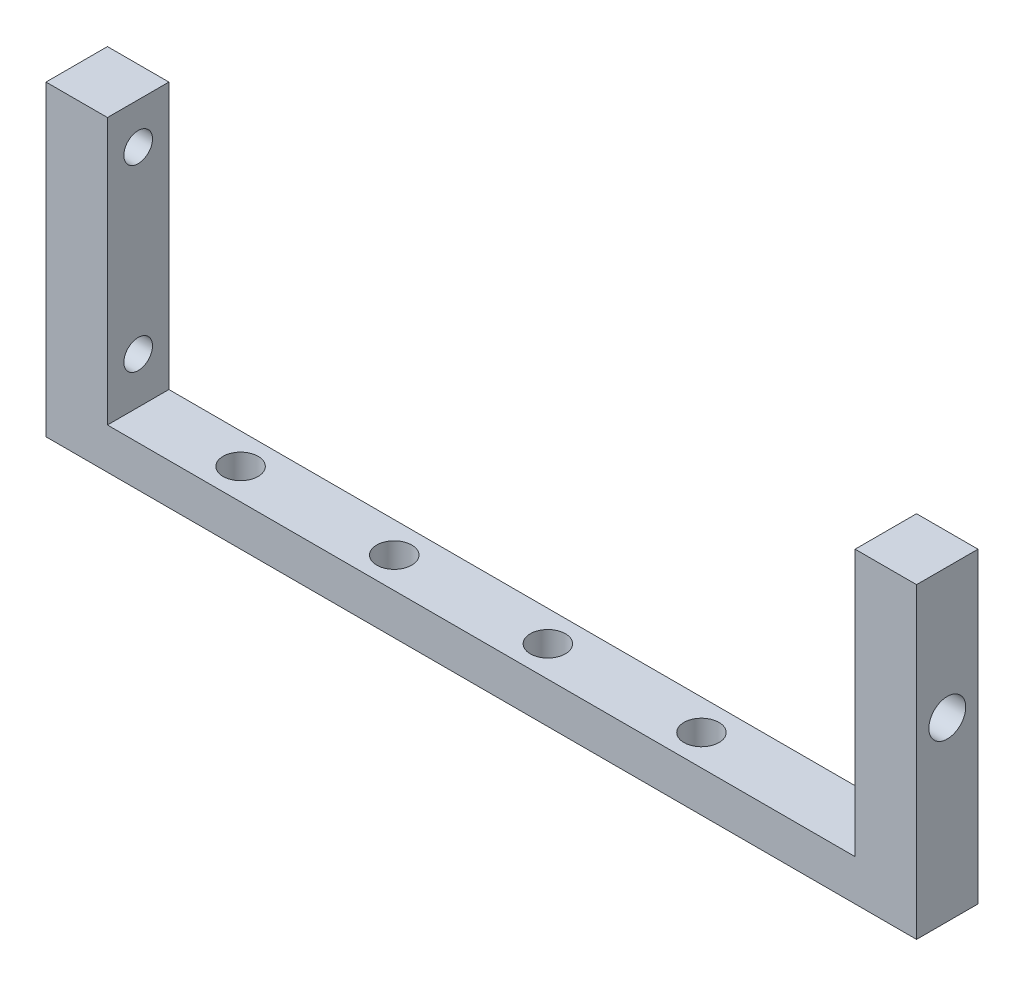
ISO-10303-21;
HEADER;
FILE_DESCRIPTION(('STEP AP214'),'2;1');
FILE_NAME('part.step','',(''),(''),'','','');
FILE_SCHEMA(('AUTOMOTIVE_DESIGN { 1 0 10303 214 1 1 1 1 }'));
ENDSEC;
DATA;
#1=APPLICATION_CONTEXT('core data for automotive mechanical design processes');
#2=APPLICATION_PROTOCOL_DEFINITION('international standard','automotive_design',2000,#1);
#3=PRODUCT_CONTEXT('',#1,'mechanical');
#4=PRODUCT('Part','Part','',(#3));
#5=PRODUCT_RELATED_PRODUCT_CATEGORY('part','',(#4));
#6=PRODUCT_DEFINITION_FORMATION('','',#4);
#7=PRODUCT_DEFINITION_CONTEXT('part definition',#1,'design');
#8=PRODUCT_DEFINITION('design','',#6,#7);
#9=PRODUCT_DEFINITION_SHAPE('','',#8);
#10=(LENGTH_UNIT() NAMED_UNIT(*) SI_UNIT(.MILLI.,.METRE.));
#11=(NAMED_UNIT(*) PLANE_ANGLE_UNIT() SI_UNIT($,.RADIAN.));
#12=(NAMED_UNIT(*) SI_UNIT($,.STERADIAN.) SOLID_ANGLE_UNIT());
#13=UNCERTAINTY_MEASURE_WITH_UNIT(LENGTH_MEASURE(1.E-05),#10,'distance_accuracy_value','');
#14=(GEOMETRIC_REPRESENTATION_CONTEXT(3) GLOBAL_UNCERTAINTY_ASSIGNED_CONTEXT((#13)) GLOBAL_UNIT_ASSIGNED_CONTEXT((#10,
#11,#12)) REPRESENTATION_CONTEXT('',''));
#15=CARTESIAN_POINT('',(0.,0.,0.));
#16=DIRECTION('',(0.,0.,1.));
#17=DIRECTION('',(1.,0.,0.));
#18=AXIS2_PLACEMENT_3D('',#15,#16,#17);
#19=CARTESIAN_POINT('',(0.,5.08,0.));
#20=DIRECTION('',(0.,1.,0.));
#21=DIRECTION('',(0.,0.,1.));
#22=AXIS2_PLACEMENT_3D('',#19,#20,#21);
#23=PLANE('',#22);
#24=CARTESIAN_POINT('',(-87.63,5.08,10.4548771292027));
#25=DIRECTION('',(0.,1.,0.));
#26=DIRECTION('',(0.,0.,1.));
#27=AXIS2_PLACEMENT_3D('',#24,#25,#26);
#28=CIRCLE('',#27,2.1717);
#29=CARTESIAN_POINT('',(-87.63,5.08,12.6265771292026));
#30=VERTEX_POINT('',#29);
#31=EDGE_CURVE('E398',#30,#30,#28,.T.);
#32=ORIENTED_EDGE('',*,*,#31,.F.);
#33=EDGE_LOOP('',(#32));
#34=FACE_BOUND('',#33,.T.);
#35=CARTESIAN_POINT('',(-68.58,5.08,10.4548771292027));
#36=DIRECTION('',(0.,1.,0.));
#37=DIRECTION('',(0.,0.,1.));
#38=AXIS2_PLACEMENT_3D('',#35,#36,#37);
#39=CIRCLE('',#38,2.1717);
#40=CARTESIAN_POINT('',(-68.58,5.08,12.6265771292026));
#41=VERTEX_POINT('',#40);
#42=EDGE_CURVE('E392',#41,#41,#39,.T.);
#43=ORIENTED_EDGE('',*,*,#42,.F.);
#44=EDGE_LOOP('',(#43));
#45=FACE_BOUND('',#44,.T.);
#46=CARTESIAN_POINT('',(-49.5300000000001,5.08,10.4548771292027));
#47=DIRECTION('',(0.,1.,0.));
#48=DIRECTION('',(0.,0.,1.));
#49=AXIS2_PLACEMENT_3D('',#46,#47,#48);
#50=CIRCLE('',#49,2.17169999999993);
#51=CARTESIAN_POINT('',(-49.5300000000001,5.08,12.6265771292026));
#52=VERTEX_POINT('',#51);
#53=EDGE_CURVE('E386',#52,#52,#50,.T.);
#54=ORIENTED_EDGE('',*,*,#53,.F.);
#55=EDGE_LOOP('',(#54));
#56=FACE_BOUND('',#55,.T.);
#57=CARTESIAN_POINT('',(-30.48,5.08,10.4548771292027));
#58=DIRECTION('',(0.,1.,0.));
#59=DIRECTION('',(0.,0.,1.));
#60=AXIS2_PLACEMENT_3D('',#57,#58,#59);
#61=CIRCLE('',#60,2.1717);
#62=CARTESIAN_POINT('',(-30.48,5.08,12.6265771292026));
#63=VERTEX_POINT('',#62);
#64=EDGE_CURVE('E372',#63,#63,#61,.T.);
#65=ORIENTED_EDGE('',*,*,#64,.F.);
#66=EDGE_LOOP('',(#65));
#67=FACE_BOUND('',#66,.T.);
#68=DIRECTION('',(1.,0.,0.));
#69=VECTOR('',#68,1.);
#70=CARTESIAN_POINT('',(-107.95,5.08,14.2648771292027));
#71=LINE('',#70,#69);
#72=CARTESIAN_POINT('',(-100.33,5.08,14.2648771292027));
#73=VERTEX_POINT('',#72);
#74=CARTESIAN_POINT('',(-7.62,5.08,14.2648771292027));
#75=VERTEX_POINT('',#74);
#76=EDGE_CURVE('E53',#73,#75,#71,.T.);
#77=ORIENTED_EDGE('',*,*,#76,.T.);
#78=DIRECTION('',(0.,0.,1.));
#79=VECTOR('',#78,1.);
#80=CARTESIAN_POINT('',(-7.62,5.08,14.2648771292027));
#81=LINE('',#80,#79);
#82=CARTESIAN_POINT('',(-7.62,5.08,6.64487712920265));
#83=VERTEX_POINT('',#82);
#84=EDGE_CURVE('E48',#83,#75,#81,.T.);
#85=ORIENTED_EDGE('',*,*,#84,.F.);
#86=DIRECTION('',(-1.,0.,0.));
#87=VECTOR('',#86,1.);
#88=CARTESIAN_POINT('',(-107.95,5.08,6.64487712920265));
#89=LINE('',#88,#87);
#90=CARTESIAN_POINT('',(-100.33,5.08,6.64487712920265));
#91=VERTEX_POINT('',#90);
#92=EDGE_CURVE('E155',#83,#91,#89,.T.);
#93=ORIENTED_EDGE('',*,*,#92,.T.);
#94=DIRECTION('',(0.,0.,-1.));
#95=VECTOR('',#94,1.);
#96=CARTESIAN_POINT('',(-100.33,5.08,14.2648771292027));
#97=LINE('',#96,#95);
#98=EDGE_CURVE('E134',#73,#91,#97,.T.);
#99=ORIENTED_EDGE('',*,*,#98,.F.);
#100=EDGE_LOOP('',(#77,#85,#93,#99));
#101=FACE_BOUND('',#100,.T.);
#102=ADVANCED_FACE('F33',(#34,#45,#56,#67,#101),#23,.T.);
#103=CARTESIAN_POINT('',(-107.95,5.08,6.64487712920265));
#104=DIRECTION('',(1.,0.,0.));
#105=DIRECTION('',(0.,0.,-1.));
#106=AXIS2_PLACEMENT_3D('',#103,#104,#105);
#107=PLANE('',#106);
#108=CARTESIAN_POINT('',(-107.95,33.02,10.4548771292027));
#109=DIRECTION('',(1.,0.,0.));
#110=DIRECTION('',(0.,0.,-1.));
#111=AXIS2_PLACEMENT_3D('',#108,#109,#110);
#112=CIRCLE('',#111,1.778);
#113=CARTESIAN_POINT('',(-107.95,33.02,8.67687712920265));
#114=VERTEX_POINT('',#113);
#115=EDGE_CURVE('E122',#114,#114,#112,.T.);
#116=ORIENTED_EDGE('',*,*,#115,.T.);
#117=EDGE_LOOP('',(#116));
#118=FACE_BOUND('',#117,.T.);
#119=CARTESIAN_POINT('',(-107.95,10.795,10.4548771292027));
#120=DIRECTION('',(1.,0.,0.));
#121=DIRECTION('',(0.,0.,-1.));
#122=AXIS2_PLACEMENT_3D('',#119,#120,#121);
#123=CIRCLE('',#122,1.778);
#124=CARTESIAN_POINT('',(-107.95,10.795,8.67687712920265));
#125=VERTEX_POINT('',#124);
#126=EDGE_CURVE('E358',#125,#125,#123,.T.);
#127=ORIENTED_EDGE('',*,*,#126,.T.);
#128=EDGE_LOOP('',(#127));
#129=FACE_BOUND('',#128,.T.);
#130=DIRECTION('',(0.,0.,1.));
#131=VECTOR('',#130,1.);
#132=CARTESIAN_POINT('',(-107.95,0.,6.64487712920265));
#133=LINE('',#132,#131);
#134=CARTESIAN_POINT('',(-107.95,0.,6.64487712920265));
#135=VERTEX_POINT('',#134);
#136=CARTESIAN_POINT('',(-107.95,0.,14.2648771292027));
#137=VERTEX_POINT('',#136);
#138=EDGE_CURVE('E153',#135,#137,#133,.T.);
#139=ORIENTED_EDGE('',*,*,#138,.T.);
#140=DIRECTION('',(0.,-1.,0.));
#141=VECTOR('',#140,1.);
#142=CARTESIAN_POINT('',(-107.95,5.08,14.2648771292027));
#143=LINE('',#142,#141);
#144=CARTESIAN_POINT('',(-107.95,38.1,14.2648771292027));
#145=VERTEX_POINT('',#144);
#146=EDGE_CURVE('E11',#145,#137,#143,.T.);
#147=ORIENTED_EDGE('',*,*,#146,.F.);
#148=DIRECTION('',(0.,0.,1.));
#149=VECTOR('',#148,1.);
#150=CARTESIAN_POINT('',(-107.95,38.1,14.2648771292027));
#151=LINE('',#150,#149);
#152=CARTESIAN_POINT('',(-107.95,38.1,6.64487712920265));
#153=VERTEX_POINT('',#152);
#154=EDGE_CURVE('E135',#153,#145,#151,.T.);
#155=ORIENTED_EDGE('',*,*,#154,.F.);
#156=DIRECTION('',(0.,-1.,0.));
#157=VECTOR('',#156,1.);
#158=CARTESIAN_POINT('',(-107.95,5.08,6.64487712920265));
#159=LINE('',#158,#157);
#160=EDGE_CURVE('E106',#153,#135,#159,.T.);
#161=ORIENTED_EDGE('',*,*,#160,.T.);
#162=EDGE_LOOP('',(#139,#147,#155,#161));
#163=FACE_BOUND('',#162,.T.);
#164=ADVANCED_FACE('F35',(#118,#129,#163),#107,.F.);
#165=CARTESIAN_POINT('',(-107.95,5.08,14.2648771292027));
#166=DIRECTION('',(0.,0.,-1.));
#167=DIRECTION('',(-1.,0.,0.));
#168=AXIS2_PLACEMENT_3D('',#165,#166,#167);
#169=PLANE('',#168);
#170=DIRECTION('',(1.,0.,0.));
#171=VECTOR('',#170,1.);
#172=CARTESIAN_POINT('',(-107.95,0.,14.2648771292027));
#173=LINE('',#172,#171);
#174=CARTESIAN_POINT('',(0.,0.,14.2648771292027));
#175=VERTEX_POINT('',#174);
#176=EDGE_CURVE('E160',#137,#175,#173,.T.);
#177=ORIENTED_EDGE('',*,*,#176,.T.);
#178=DIRECTION('',(0.,-1.,0.));
#179=VECTOR('',#178,1.);
#180=CARTESIAN_POINT('',(0.,5.08,14.2648771292027));
#181=LINE('',#180,#179);
#182=CARTESIAN_POINT('',(0.,38.1,14.2648771292027));
#183=VERTEX_POINT('',#182);
#184=EDGE_CURVE('E41',#183,#175,#181,.T.);
#185=ORIENTED_EDGE('',*,*,#184,.F.);
#186=DIRECTION('',(1.,0.,0.));
#187=VECTOR('',#186,1.);
#188=CARTESIAN_POINT('',(0.,38.1,14.2648771292027));
#189=LINE('',#188,#187);
#190=CARTESIAN_POINT('',(-7.62,38.1,14.2648771292027));
#191=VERTEX_POINT('',#190);
#192=EDGE_CURVE('E120',#191,#183,#189,.T.);
#193=ORIENTED_EDGE('',*,*,#192,.F.);
#194=DIRECTION('',(0.,-1.,0.));
#195=VECTOR('',#194,1.);
#196=CARTESIAN_POINT('',(-7.62,38.1,14.2648771292027));
#197=LINE('',#196,#195);
#198=EDGE_CURVE('E129',#191,#75,#197,.T.);
#199=ORIENTED_EDGE('',*,*,#198,.T.);
#200=ORIENTED_EDGE('',*,*,#76,.F.);
#201=DIRECTION('',(0.,-1.,0.));
#202=VECTOR('',#201,1.);
#203=CARTESIAN_POINT('',(-100.33,38.1,14.2648771292027));
#204=LINE('',#203,#202);
#205=CARTESIAN_POINT('',(-100.33,38.1,14.2648771292027));
#206=VERTEX_POINT('',#205);
#207=EDGE_CURVE('E150',#206,#73,#204,.T.);
#208=ORIENTED_EDGE('',*,*,#207,.F.);
#209=DIRECTION('',(1.,0.,0.));
#210=VECTOR('',#209,1.);
#211=CARTESIAN_POINT('',(-107.95,38.1,14.2648771292027));
#212=LINE('',#211,#210);
#213=EDGE_CURVE('E138',#145,#206,#212,.T.);
#214=ORIENTED_EDGE('',*,*,#213,.F.);
#215=ORIENTED_EDGE('',*,*,#146,.T.);
#216=EDGE_LOOP('',(#177,#185,#193,#199,#200,#208,#214,#215));
#217=FACE_BOUND('',#216,.T.);
#218=ADVANCED_FACE('F180',(#217),#169,.F.);
#219=CARTESIAN_POINT('',(0.,5.08,6.64487712920265));
#220=DIRECTION('',(-1.,0.,0.));
#221=DIRECTION('',(0.,0.,1.));
#222=AXIS2_PLACEMENT_3D('',#219,#220,#221);
#223=PLANE('',#222);
#224=CARTESIAN_POINT('',(0.,21.9075,10.4548771292027));
#225=DIRECTION('',(-1.,0.,0.));
#226=DIRECTION('',(0.,0.,1.));
#227=AXIS2_PLACEMENT_3D('',#224,#225,#226);
#228=CIRCLE('',#227,2.286);
#229=CARTESIAN_POINT('',(0.,21.9075,12.7408771292027));
#230=VERTEX_POINT('',#229);
#231=EDGE_CURVE('E362',#230,#230,#228,.T.);
#232=ORIENTED_EDGE('',*,*,#231,.T.);
#233=EDGE_LOOP('',(#232));
#234=FACE_BOUND('',#233,.T.);
#235=DIRECTION('',(0.,0.,-1.));
#236=VECTOR('',#235,1.);
#237=CARTESIAN_POINT('',(0.,0.,6.64487712920265));
#238=LINE('',#237,#236);
#239=CARTESIAN_POINT('',(0.,0.,6.64487712920265));
#240=VERTEX_POINT('',#239);
#241=EDGE_CURVE('E103',#175,#240,#238,.T.);
#242=ORIENTED_EDGE('',*,*,#241,.T.);
#243=DIRECTION('',(0.,-1.,0.));
#244=VECTOR('',#243,1.);
#245=CARTESIAN_POINT('',(0.,5.08,6.64487712920265));
#246=LINE('',#245,#244);
#247=CARTESIAN_POINT('',(0.,38.1,6.64487712920265));
#248=VERTEX_POINT('',#247);
#249=EDGE_CURVE('E96',#248,#240,#246,.T.);
#250=ORIENTED_EDGE('',*,*,#249,.F.);
#251=DIRECTION('',(0.,0.,-1.));
#252=VECTOR('',#251,1.);
#253=CARTESIAN_POINT('',(0.,38.1,14.2648771292027));
#254=LINE('',#253,#252);
#255=EDGE_CURVE('E101',#183,#248,#254,.T.);
#256=ORIENTED_EDGE('',*,*,#255,.F.);
#257=ORIENTED_EDGE('',*,*,#184,.T.);
#258=EDGE_LOOP('',(#242,#250,#256,#257));
#259=FACE_BOUND('',#258,.T.);
#260=ADVANCED_FACE('F98',(#234,#259),#223,.F.);
#261=CARTESIAN_POINT('',(-107.95,5.08,6.64487712920265));
#262=DIRECTION('',(0.,0.,1.));
#263=DIRECTION('',(1.,0.,0.));
#264=AXIS2_PLACEMENT_3D('',#261,#262,#263);
#265=PLANE('',#264);
#266=DIRECTION('',(-1.,0.,0.));
#267=VECTOR('',#266,1.);
#268=CARTESIAN_POINT('',(-107.95,0.,6.64487712920265));
#269=LINE('',#268,#267);
#270=EDGE_CURVE('E156',#240,#135,#269,.T.);
#271=ORIENTED_EDGE('',*,*,#270,.T.);
#272=ORIENTED_EDGE('',*,*,#160,.F.);
#273=DIRECTION('',(-1.,0.,0.));
#274=VECTOR('',#273,1.);
#275=CARTESIAN_POINT('',(-107.95,38.1,6.64487712920265));
#276=LINE('',#275,#274);
#277=CARTESIAN_POINT('',(-100.33,38.1,6.64487712920265));
#278=VERTEX_POINT('',#277);
#279=EDGE_CURVE('E142',#278,#153,#276,.T.);
#280=ORIENTED_EDGE('',*,*,#279,.F.);
#281=DIRECTION('',(0.,-1.,0.));
#282=VECTOR('',#281,1.);
#283=CARTESIAN_POINT('',(-100.33,38.1,6.64487712920265));
#284=LINE('',#283,#282);
#285=EDGE_CURVE('E145',#278,#91,#284,.T.);
#286=ORIENTED_EDGE('',*,*,#285,.T.);
#287=ORIENTED_EDGE('',*,*,#92,.F.);
#288=DIRECTION('',(0.,-1.,0.));
#289=VECTOR('',#288,1.);
#290=CARTESIAN_POINT('',(-7.62,38.1,6.64487712920265));
#291=LINE('',#290,#289);
#292=CARTESIAN_POINT('',(-7.62,38.1,6.64487712920265));
#293=VERTEX_POINT('',#292);
#294=EDGE_CURVE('E112',#293,#83,#291,.T.);
#295=ORIENTED_EDGE('',*,*,#294,.F.);
#296=DIRECTION('',(-1.,0.,0.));
#297=VECTOR('',#296,1.);
#298=CARTESIAN_POINT('',(0.,38.1,6.64487712920265));
#299=LINE('',#298,#297);
#300=EDGE_CURVE('E109',#248,#293,#299,.T.);
#301=ORIENTED_EDGE('',*,*,#300,.F.);
#302=ORIENTED_EDGE('',*,*,#249,.T.);
#303=EDGE_LOOP('',(#271,#272,#280,#286,#287,#295,#301,#302));
#304=FACE_BOUND('',#303,.T.);
#305=ADVANCED_FACE('F110',(#304),#265,.F.);
#306=CARTESIAN_POINT('',(0.,0.,0.));
#307=DIRECTION('',(0.,1.,0.));
#308=DIRECTION('',(0.,0.,1.));
#309=AXIS2_PLACEMENT_3D('',#306,#307,#308);
#310=PLANE('',#309);
#311=CARTESIAN_POINT('',(-87.63,0.,10.4548771292027));
#312=DIRECTION('',(0.,1.,0.));
#313=DIRECTION('',(0.,0.,1.));
#314=AXIS2_PLACEMENT_3D('',#311,#312,#313);
#315=CIRCLE('',#314,2.1717);
#316=CARTESIAN_POINT('',(-87.63,0.,12.6265771292026));
#317=VERTEX_POINT('',#316);
#318=EDGE_CURVE('E369',#317,#317,#315,.T.);
#319=ORIENTED_EDGE('',*,*,#318,.T.);
#320=EDGE_LOOP('',(#319));
#321=FACE_BOUND('',#320,.T.);
#322=CARTESIAN_POINT('',(-68.58,0.,10.4548771292027));
#323=DIRECTION('',(0.,1.,0.));
#324=DIRECTION('',(0.,0.,1.));
#325=AXIS2_PLACEMENT_3D('',#322,#323,#324);
#326=CIRCLE('',#325,2.1717);
#327=CARTESIAN_POINT('',(-68.58,0.,12.6265771292026));
#328=VERTEX_POINT('',#327);
#329=EDGE_CURVE('E395',#328,#328,#326,.T.);
#330=ORIENTED_EDGE('',*,*,#329,.T.);
#331=EDGE_LOOP('',(#330));
#332=FACE_BOUND('',#331,.T.);
#333=CARTESIAN_POINT('',(-49.5300000000001,0.,10.4548771292027));
#334=DIRECTION('',(0.,1.,0.));
#335=DIRECTION('',(0.,0.,1.));
#336=AXIS2_PLACEMENT_3D('',#333,#334,#335);
#337=CIRCLE('',#336,2.17169999999993);
#338=CARTESIAN_POINT('',(-49.5300000000001,0.,12.6265771292026));
#339=VERTEX_POINT('',#338);
#340=EDGE_CURVE('E389',#339,#339,#337,.T.);
#341=ORIENTED_EDGE('',*,*,#340,.T.);
#342=EDGE_LOOP('',(#341));
#343=FACE_BOUND('',#342,.T.);
#344=CARTESIAN_POINT('',(-30.48,0.,10.4548771292027));
#345=DIRECTION('',(0.,1.,0.));
#346=DIRECTION('',(0.,0.,1.));
#347=AXIS2_PLACEMENT_3D('',#344,#345,#346);
#348=CIRCLE('',#347,2.1717);
#349=CARTESIAN_POINT('',(-30.48,0.,12.6265771292026));
#350=VERTEX_POINT('',#349);
#351=EDGE_CURVE('E383',#350,#350,#348,.T.);
#352=ORIENTED_EDGE('',*,*,#351,.T.);
#353=EDGE_LOOP('',(#352));
#354=FACE_BOUND('',#353,.T.);
#355=ORIENTED_EDGE('',*,*,#138,.F.);
#356=ORIENTED_EDGE('',*,*,#270,.F.);
#357=ORIENTED_EDGE('',*,*,#241,.F.);
#358=ORIENTED_EDGE('',*,*,#176,.F.);
#359=EDGE_LOOP('',(#355,#356,#357,#358));
#360=FACE_BOUND('',#359,.T.);
#361=ADVANCED_FACE('F168',(#321,#332,#343,#354,#360),#310,.F.);
#362=CARTESIAN_POINT('',(-100.33,38.1,14.2648771292027));
#363=DIRECTION('',(-1.,0.,0.));
#364=DIRECTION('',(0.,0.,1.));
#365=AXIS2_PLACEMENT_3D('',#362,#363,#364);
#366=PLANE('',#365);
#367=CARTESIAN_POINT('',(-100.33,33.02,10.4548771292027));
#368=DIRECTION('',(1.,0.,0.));
#369=DIRECTION('',(0.,0.,-1.));
#370=AXIS2_PLACEMENT_3D('',#367,#368,#369);
#371=CIRCLE('',#370,1.778);
#372=CARTESIAN_POINT('',(-100.33,33.02,8.67687712920265));
#373=VERTEX_POINT('',#372);
#374=EDGE_CURVE('E363',#373,#373,#371,.T.);
#375=ORIENTED_EDGE('',*,*,#374,.F.);
#376=EDGE_LOOP('',(#375));
#377=FACE_BOUND('',#376,.T.);
#378=CARTESIAN_POINT('',(-100.33,10.795,10.4548771292027));
#379=DIRECTION('',(1.,0.,0.));
#380=DIRECTION('',(0.,0.,-1.));
#381=AXIS2_PLACEMENT_3D('',#378,#379,#380);
#382=CIRCLE('',#381,1.778);
#383=CARTESIAN_POINT('',(-100.33,10.795,8.67687712920265));
#384=VERTEX_POINT('',#383);
#385=EDGE_CURVE('E125',#384,#384,#382,.T.);
#386=ORIENTED_EDGE('',*,*,#385,.F.);
#387=EDGE_LOOP('',(#386));
#388=FACE_BOUND('',#387,.T.);
#389=ORIENTED_EDGE('',*,*,#98,.T.);
#390=ORIENTED_EDGE('',*,*,#285,.F.);
#391=DIRECTION('',(0.,0.,-1.));
#392=VECTOR('',#391,1.);
#393=CARTESIAN_POINT('',(-100.33,38.1,14.2648771292027));
#394=LINE('',#393,#392);
#395=EDGE_CURVE('E140',#206,#278,#394,.T.);
#396=ORIENTED_EDGE('',*,*,#395,.F.);
#397=ORIENTED_EDGE('',*,*,#207,.T.);
#398=EDGE_LOOP('',(#389,#390,#396,#397));
#399=FACE_BOUND('',#398,.T.);
#400=ADVANCED_FACE('F179',(#377,#388,#399),#366,.F.);
#401=CARTESIAN_POINT('',(0.,38.1,0.));
#402=DIRECTION('',(0.,-1.,0.));
#403=DIRECTION('',(0.,0.,-1.));
#404=AXIS2_PLACEMENT_3D('',#401,#402,#403);
#405=PLANE('',#404);
#406=ORIENTED_EDGE('',*,*,#154,.T.);
#407=ORIENTED_EDGE('',*,*,#213,.T.);
#408=ORIENTED_EDGE('',*,*,#395,.T.);
#409=ORIENTED_EDGE('',*,*,#279,.T.);
#410=EDGE_LOOP('',(#406,#407,#408,#409));
#411=FACE_BOUND('',#410,.T.);
#412=ADVANCED_FACE('F174',(#411),#405,.F.);
#413=CARTESIAN_POINT('',(-7.62,38.1,14.2648771292027));
#414=DIRECTION('',(1.,0.,0.));
#415=DIRECTION('',(0.,0.,-1.));
#416=AXIS2_PLACEMENT_3D('',#413,#414,#415);
#417=PLANE('',#416);
#418=CARTESIAN_POINT('',(-7.62,21.9075,10.4548771292027));
#419=DIRECTION('',(-1.,0.,0.));
#420=DIRECTION('',(0.,0.,1.));
#421=AXIS2_PLACEMENT_3D('',#418,#419,#420);
#422=CIRCLE('',#421,2.286);
#423=CARTESIAN_POINT('',(-7.62,21.9075,12.7408771292027));
#424=VERTEX_POINT('',#423);
#425=EDGE_CURVE('E365',#424,#424,#422,.T.);
#426=ORIENTED_EDGE('',*,*,#425,.F.);
#427=EDGE_LOOP('',(#426));
#428=FACE_BOUND('',#427,.T.);
#429=ORIENTED_EDGE('',*,*,#84,.T.);
#430=ORIENTED_EDGE('',*,*,#198,.F.);
#431=DIRECTION('',(0.,0.,1.));
#432=VECTOR('',#431,1.);
#433=CARTESIAN_POINT('',(-7.62,38.1,14.2648771292027));
#434=LINE('',#433,#432);
#435=EDGE_CURVE('E115',#293,#191,#434,.T.);
#436=ORIENTED_EDGE('',*,*,#435,.F.);
#437=ORIENTED_EDGE('',*,*,#294,.T.);
#438=EDGE_LOOP('',(#429,#430,#436,#437));
#439=FACE_BOUND('',#438,.T.);
#440=ADVANCED_FACE('F183',(#428,#439),#417,.F.);
#441=CARTESIAN_POINT('',(0.,38.1,0.));
#442=DIRECTION('',(0.,1.,0.));
#443=DIRECTION('',(0.,0.,1.));
#444=AXIS2_PLACEMENT_3D('',#441,#442,#443);
#445=PLANE('',#444);
#446=ORIENTED_EDGE('',*,*,#255,.T.);
#447=ORIENTED_EDGE('',*,*,#300,.T.);
#448=ORIENTED_EDGE('',*,*,#435,.T.);
#449=ORIENTED_EDGE('',*,*,#192,.T.);
#450=EDGE_LOOP('',(#446,#447,#448,#449));
#451=FACE_BOUND('',#450,.T.);
#452=ADVANCED_FACE('F118',(#451),#445,.T.);
#453=CARTESIAN_POINT('',(-107.95,10.795,10.4548771292027));
#454=DIRECTION('',(1.,0.,0.));
#455=DIRECTION('',(0.,0.,-1.));
#456=AXIS2_PLACEMENT_3D('',#453,#454,#455);
#457=CYLINDRICAL_SURFACE('',#456,1.778);
#458=CARTESIAN_POINT('',(-107.95,10.795,8.67687712920265));
#459=CARTESIAN_POINT('',(-107.870625,10.795,8.67687712920265));
#460=CARTESIAN_POINT('',(-107.79125,10.795,8.67687712920265));
#461=CARTESIAN_POINT('',(-107.6325,10.795,8.67687712920265));
#462=CARTESIAN_POINT('',(-107.553125,10.795,8.67687712920265));
#463=CARTESIAN_POINT('',(-107.394375,10.795,8.67687712920265));
#464=CARTESIAN_POINT('',(-107.315,10.795,8.67687712920265));
#465=CARTESIAN_POINT('',(-107.15625,10.795,8.67687712920265));
#466=CARTESIAN_POINT('',(-107.076875,10.795,8.67687712920265));
#467=CARTESIAN_POINT('',(-106.918125,10.795,8.67687712920265));
#468=CARTESIAN_POINT('',(-106.83875,10.795,8.67687712920265));
#469=CARTESIAN_POINT('',(-106.68,10.795,8.67687712920265));
#470=CARTESIAN_POINT('',(-106.600625,10.795,8.67687712920265));
#471=CARTESIAN_POINT('',(-106.441875,10.795,8.67687712920265));
#472=CARTESIAN_POINT('',(-106.3625,10.795,8.67687712920265));
#473=CARTESIAN_POINT('',(-106.20375,10.795,8.67687712920265));
#474=CARTESIAN_POINT('',(-106.124375,10.795,8.67687712920265));
#475=CARTESIAN_POINT('',(-105.965625,10.795,8.67687712920265));
#476=CARTESIAN_POINT('',(-105.88625,10.795,8.67687712920265));
#477=CARTESIAN_POINT('',(-105.7275,10.795,8.67687712920265));
#478=CARTESIAN_POINT('',(-105.648125,10.795,8.67687712920265));
#479=CARTESIAN_POINT('',(-105.489375,10.795,8.67687712920265));
#480=CARTESIAN_POINT('',(-105.41,10.795,8.67687712920265));
#481=CARTESIAN_POINT('',(-105.25125,10.795,8.67687712920265));
#482=CARTESIAN_POINT('',(-105.171875,10.795,8.67687712920265));
#483=CARTESIAN_POINT('',(-105.013125,10.795,8.67687712920265));
#484=CARTESIAN_POINT('',(-104.93375,10.795,8.67687712920265));
#485=CARTESIAN_POINT('',(-104.775,10.795,8.67687712920265));
#486=CARTESIAN_POINT('',(-104.695625,10.795,8.67687712920265));
#487=CARTESIAN_POINT('',(-104.536875,10.795,8.67687712920265));
#488=CARTESIAN_POINT('',(-104.4575,10.795,8.67687712920265));
#489=CARTESIAN_POINT('',(-104.29875,10.795,8.67687712920265));
#490=CARTESIAN_POINT('',(-104.219375,10.795,8.67687712920265));
#491=CARTESIAN_POINT('',(-104.060625,10.795,8.67687712920265));
#492=CARTESIAN_POINT('',(-103.98125,10.795,8.67687712920265));
#493=CARTESIAN_POINT('',(-103.8225,10.795,8.67687712920265));
#494=CARTESIAN_POINT('',(-103.743125,10.795,8.67687712920265));
#495=CARTESIAN_POINT('',(-103.584375,10.795,8.67687712920265));
#496=CARTESIAN_POINT('',(-103.505,10.795,8.67687712920265));
#497=CARTESIAN_POINT('',(-103.34625,10.795,8.67687712920265));
#498=CARTESIAN_POINT('',(-103.266875,10.795,8.67687712920265));
#499=CARTESIAN_POINT('',(-103.108125,10.795,8.67687712920265));
#500=CARTESIAN_POINT('',(-103.02875,10.795,8.67687712920265));
#501=CARTESIAN_POINT('',(-102.87,10.795,8.67687712920265));
#502=CARTESIAN_POINT('',(-102.790625,10.795,8.67687712920265));
#503=CARTESIAN_POINT('',(-102.631875,10.795,8.67687712920265));
#504=CARTESIAN_POINT('',(-102.5525,10.795,8.67687712920265));
#505=CARTESIAN_POINT('',(-102.39375,10.795,8.67687712920265));
#506=CARTESIAN_POINT('',(-102.314375,10.795,8.67687712920265));
#507=CARTESIAN_POINT('',(-102.155625,10.795,8.67687712920265));
#508=CARTESIAN_POINT('',(-102.07625,10.795,8.67687712920265));
#509=CARTESIAN_POINT('',(-101.9175,10.795,8.67687712920265));
#510=CARTESIAN_POINT('',(-101.838125,10.795,8.67687712920265));
#511=CARTESIAN_POINT('',(-101.679375,10.795,8.67687712920265));
#512=CARTESIAN_POINT('',(-101.6,10.795,8.67687712920265));
#513=CARTESIAN_POINT('',(-101.44125,10.795,8.67687712920265));
#514=CARTESIAN_POINT('',(-101.361875,10.795,8.67687712920265));
#515=CARTESIAN_POINT('',(-101.203125,10.795,8.67687712920265));
#516=CARTESIAN_POINT('',(-101.12375,10.795,8.67687712920265));
#517=CARTESIAN_POINT('',(-100.965,10.795,8.67687712920265));
#518=CARTESIAN_POINT('',(-100.885625,10.795,8.67687712920265));
#519=CARTESIAN_POINT('',(-100.726875,10.795,8.67687712920265));
#520=CARTESIAN_POINT('',(-100.6475,10.795,8.67687712920265));
#521=CARTESIAN_POINT('',(-100.48875,10.795,8.67687712920265));
#522=CARTESIAN_POINT('',(-100.409375,10.795,8.67687712920265));
#523=CARTESIAN_POINT('',(-100.33,10.795,8.67687712920265));
#524=B_SPLINE_CURVE_WITH_KNOTS('',3,(#458,#459,#460,#461,#462,#463,#464,#465,#466,#467,#468,
#469,#470,#471,#472,#473,#474,#475,#476,#477,#478,#479,#480,#481,#482,#483,#484,#485,#486,#487,
#488,#489,#490,#491,#492,#493,#494,#495,#496,#497,#498,#499,#500,#501,#502,#503,#504,#505,#506,
#507,#508,#509,#510,#511,#512,#513,#514,#515,#516,#517,#518,#519,#520,#521,#522,#523),
.UNSPECIFIED.,.F.,.F.,(4,2,2,2,2,2,2,2,2,2,2,2,2,2,2,2,2,2,2,2,2,2,2,2,2,2,2,2,2,2,2,2,4),(0.,
0.238125000000006,0.476250000000011,0.714375000000003,0.952500000000009,1.190625,
1.42875000000001,1.66687500000001,1.905,2.14312500000001,2.38125,2.61937500000001,
2.85750000000001,3.095625,3.33375000000001,3.571875,3.81000000000001,4.04812500000001,
4.28625000000001,4.52437500000001,4.7625,5.00062500000001,5.23875000000001,5.47687500000001,
5.71500000000001,5.953125,6.19125000000001,6.42937500000001,6.66750000000001,6.90562500000001,
7.14375,7.38187500000001,7.62000000000002),.UNSPECIFIED.);
#525=EDGE_CURVE('BSEAM191',#125,#384,#524,.T.);
#526=ORIENTED_EDGE('',*,*,#126,.F.);
#527=ORIENTED_EDGE('',*,*,#385,.T.);
#528=ORIENTED_EDGE('',*,*,#525,.T.);
#529=ORIENTED_EDGE('',*,*,#525,.F.);
#530=EDGE_LOOP('',(#526,#528,#527,#529));
#531=FACE_BOUND('',#530,.T.);
#532=ADVANCED_FACE('F191',(#531),#457,.F.);
#533=CARTESIAN_POINT('',(-107.95,33.02,10.4548771292027));
#534=DIRECTION('',(1.,0.,0.));
#535=DIRECTION('',(0.,0.,-1.));
#536=AXIS2_PLACEMENT_3D('',#533,#534,#535);
#537=CYLINDRICAL_SURFACE('',#536,1.778);
#538=CARTESIAN_POINT('',(-107.95,33.02,8.67687712920265));
#539=CARTESIAN_POINT('',(-107.870625,33.02,8.67687712920265));
#540=CARTESIAN_POINT('',(-107.79125,33.02,8.67687712920265));
#541=CARTESIAN_POINT('',(-107.6325,33.02,8.67687712920265));
#542=CARTESIAN_POINT('',(-107.553125,33.02,8.67687712920265));
#543=CARTESIAN_POINT('',(-107.394375,33.02,8.67687712920265));
#544=CARTESIAN_POINT('',(-107.315,33.02,8.67687712920265));
#545=CARTESIAN_POINT('',(-107.15625,33.02,8.67687712920265));
#546=CARTESIAN_POINT('',(-107.076875,33.02,8.67687712920265));
#547=CARTESIAN_POINT('',(-106.918125,33.02,8.67687712920265));
#548=CARTESIAN_POINT('',(-106.83875,33.02,8.67687712920265));
#549=CARTESIAN_POINT('',(-106.68,33.02,8.67687712920265));
#550=CARTESIAN_POINT('',(-106.600625,33.02,8.67687712920265));
#551=CARTESIAN_POINT('',(-106.441875,33.02,8.67687712920265));
#552=CARTESIAN_POINT('',(-106.3625,33.02,8.67687712920265));
#553=CARTESIAN_POINT('',(-106.20375,33.02,8.67687712920265));
#554=CARTESIAN_POINT('',(-106.124375,33.02,8.67687712920265));
#555=CARTESIAN_POINT('',(-105.965625,33.02,8.67687712920265));
#556=CARTESIAN_POINT('',(-105.88625,33.02,8.67687712920265));
#557=CARTESIAN_POINT('',(-105.7275,33.02,8.67687712920265));
#558=CARTESIAN_POINT('',(-105.648125,33.02,8.67687712920265));
#559=CARTESIAN_POINT('',(-105.489375,33.02,8.67687712920265));
#560=CARTESIAN_POINT('',(-105.41,33.02,8.67687712920265));
#561=CARTESIAN_POINT('',(-105.25125,33.02,8.67687712920265));
#562=CARTESIAN_POINT('',(-105.171875,33.02,8.67687712920265));
#563=CARTESIAN_POINT('',(-105.013125,33.02,8.67687712920265));
#564=CARTESIAN_POINT('',(-104.93375,33.02,8.67687712920265));
#565=CARTESIAN_POINT('',(-104.775,33.02,8.67687712920265));
#566=CARTESIAN_POINT('',(-104.695625,33.02,8.67687712920265));
#567=CARTESIAN_POINT('',(-104.536875,33.02,8.67687712920265));
#568=CARTESIAN_POINT('',(-104.4575,33.02,8.67687712920265));
#569=CARTESIAN_POINT('',(-104.29875,33.02,8.67687712920265));
#570=CARTESIAN_POINT('',(-104.219375,33.02,8.67687712920265));
#571=CARTESIAN_POINT('',(-104.060625,33.02,8.67687712920265));
#572=CARTESIAN_POINT('',(-103.98125,33.02,8.67687712920265));
#573=CARTESIAN_POINT('',(-103.8225,33.02,8.67687712920265));
#574=CARTESIAN_POINT('',(-103.743125,33.02,8.67687712920265));
#575=CARTESIAN_POINT('',(-103.584375,33.02,8.67687712920265));
#576=CARTESIAN_POINT('',(-103.505,33.02,8.67687712920265));
#577=CARTESIAN_POINT('',(-103.34625,33.02,8.67687712920265));
#578=CARTESIAN_POINT('',(-103.266875,33.02,8.67687712920265));
#579=CARTESIAN_POINT('',(-103.108125,33.02,8.67687712920265));
#580=CARTESIAN_POINT('',(-103.02875,33.02,8.67687712920265));
#581=CARTESIAN_POINT('',(-102.87,33.02,8.67687712920265));
#582=CARTESIAN_POINT('',(-102.790625,33.02,8.67687712920265));
#583=CARTESIAN_POINT('',(-102.631875,33.02,8.67687712920265));
#584=CARTESIAN_POINT('',(-102.5525,33.02,8.67687712920265));
#585=CARTESIAN_POINT('',(-102.39375,33.02,8.67687712920265));
#586=CARTESIAN_POINT('',(-102.314375,33.02,8.67687712920265));
#587=CARTESIAN_POINT('',(-102.155625,33.02,8.67687712920265));
#588=CARTESIAN_POINT('',(-102.07625,33.02,8.67687712920265));
#589=CARTESIAN_POINT('',(-101.9175,33.02,8.67687712920265));
#590=CARTESIAN_POINT('',(-101.838125,33.02,8.67687712920265));
#591=CARTESIAN_POINT('',(-101.679375,33.02,8.67687712920265));
#592=CARTESIAN_POINT('',(-101.6,33.02,8.67687712920265));
#593=CARTESIAN_POINT('',(-101.44125,33.02,8.67687712920265));
#594=CARTESIAN_POINT('',(-101.361875,33.02,8.67687712920265));
#595=CARTESIAN_POINT('',(-101.203125,33.02,8.67687712920265));
#596=CARTESIAN_POINT('',(-101.12375,33.02,8.67687712920265));
#597=CARTESIAN_POINT('',(-100.965,33.02,8.67687712920265));
#598=CARTESIAN_POINT('',(-100.885625,33.02,8.67687712920265));
#599=CARTESIAN_POINT('',(-100.726875,33.02,8.67687712920265));
#600=CARTESIAN_POINT('',(-100.6475,33.02,8.67687712920265));
#601=CARTESIAN_POINT('',(-100.48875,33.02,8.67687712920265));
#602=CARTESIAN_POINT('',(-100.409375,33.02,8.67687712920265));
#603=CARTESIAN_POINT('',(-100.33,33.02,8.67687712920265));
#604=B_SPLINE_CURVE_WITH_KNOTS('',3,(#538,#539,#540,#541,#542,#543,#544,#545,#546,#547,#548,
#549,#550,#551,#552,#553,#554,#555,#556,#557,#558,#559,#560,#561,#562,#563,#564,#565,#566,#567,
#568,#569,#570,#571,#572,#573,#574,#575,#576,#577,#578,#579,#580,#581,#582,#583,#584,#585,#586,
#587,#588,#589,#590,#591,#592,#593,#594,#595,#596,#597,#598,#599,#600,#601,#602,#603),
.UNSPECIFIED.,.F.,.F.,(4,2,2,2,2,2,2,2,2,2,2,2,2,2,2,2,2,2,2,2,2,2,2,2,2,2,2,2,2,2,2,2,4),(0.,
0.238125000000006,0.476250000000011,0.714375000000003,0.952500000000009,1.190625,
1.42875000000001,1.66687500000001,1.905,2.14312500000001,2.38125,2.61937500000001,
2.85750000000001,3.095625,3.33375000000001,3.571875,3.81000000000001,4.04812500000001,
4.28625000000001,4.52437500000001,4.7625,5.00062500000001,5.23875000000001,5.47687500000001,
5.71500000000001,5.953125,6.19125000000001,6.42937500000001,6.66750000000001,6.90562500000001,
7.14375,7.38187500000001,7.62000000000002),.UNSPECIFIED.);
#605=EDGE_CURVE('BSEAM298',#114,#373,#604,.T.);
#606=ORIENTED_EDGE('',*,*,#115,.F.);
#607=ORIENTED_EDGE('',*,*,#374,.T.);
#608=ORIENTED_EDGE('',*,*,#605,.T.);
#609=ORIENTED_EDGE('',*,*,#605,.F.);
#610=EDGE_LOOP('',(#606,#608,#607,#609));
#611=FACE_BOUND('',#610,.T.);
#612=ADVANCED_FACE('F298',(#611),#537,.F.);
#613=CARTESIAN_POINT('',(0.,21.9075,10.4548771292027));
#614=DIRECTION('',(-1.,0.,0.));
#615=DIRECTION('',(0.,0.,1.));
#616=AXIS2_PLACEMENT_3D('',#613,#614,#615);
#617=CYLINDRICAL_SURFACE('',#616,2.286);
#618=CARTESIAN_POINT('',(0.,21.9075,12.7408771292027));
#619=CARTESIAN_POINT('',(-0.0793749999999998,21.9075,12.7408771292027));
#620=CARTESIAN_POINT('',(-0.15875,21.9075,12.7408771292027));
#621=CARTESIAN_POINT('',(-0.3175,21.9075,12.7408771292027));
#622=CARTESIAN_POINT('',(-0.396875,21.9075,12.7408771292027));
#623=CARTESIAN_POINT('',(-0.555625,21.9075,12.7408771292027));
#624=CARTESIAN_POINT('',(-0.635,21.9075,12.7408771292027));
#625=CARTESIAN_POINT('',(-0.79375,21.9075,12.7408771292027));
#626=CARTESIAN_POINT('',(-0.873125,21.9075,12.7408771292027));
#627=CARTESIAN_POINT('',(-1.031875,21.9075,12.7408771292027));
#628=CARTESIAN_POINT('',(-1.11125,21.9075,12.7408771292027));
#629=CARTESIAN_POINT('',(-1.27,21.9075,12.7408771292027));
#630=CARTESIAN_POINT('',(-1.349375,21.9075,12.7408771292027));
#631=CARTESIAN_POINT('',(-1.508125,21.9075,12.7408771292027));
#632=CARTESIAN_POINT('',(-1.5875,21.9075,12.7408771292027));
#633=CARTESIAN_POINT('',(-1.74625,21.9075,12.7408771292027));
#634=CARTESIAN_POINT('',(-1.825625,21.9075,12.7408771292027));
#635=CARTESIAN_POINT('',(-1.984375,21.9075,12.7408771292027));
#636=CARTESIAN_POINT('',(-2.06375,21.9075,12.7408771292027));
#637=CARTESIAN_POINT('',(-2.2225,21.9075,12.7408771292027));
#638=CARTESIAN_POINT('',(-2.301875,21.9075,12.7408771292027));
#639=CARTESIAN_POINT('',(-2.460625,21.9075,12.7408771292027));
#640=CARTESIAN_POINT('',(-2.54,21.9075,12.7408771292027));
#641=CARTESIAN_POINT('',(-2.69875,21.9075,12.7408771292027));
#642=CARTESIAN_POINT('',(-2.778125,21.9075,12.7408771292027));
#643=CARTESIAN_POINT('',(-2.936875,21.9075,12.7408771292027));
#644=CARTESIAN_POINT('',(-3.01625,21.9075,12.7408771292027));
#645=CARTESIAN_POINT('',(-3.175,21.9075,12.7408771292027));
#646=CARTESIAN_POINT('',(-3.254375,21.9075,12.7408771292027));
#647=CARTESIAN_POINT('',(-3.413125,21.9075,12.7408771292027));
#648=CARTESIAN_POINT('',(-3.4925,21.9075,12.7408771292027));
#649=CARTESIAN_POINT('',(-3.65125,21.9075,12.7408771292027));
#650=CARTESIAN_POINT('',(-3.730625,21.9075,12.7408771292027));
#651=CARTESIAN_POINT('',(-3.889375,21.9075,12.7408771292027));
#652=CARTESIAN_POINT('',(-3.96875,21.9075,12.7408771292027));
#653=CARTESIAN_POINT('',(-4.1275,21.9075,12.7408771292027));
#654=CARTESIAN_POINT('',(-4.206875,21.9075,12.7408771292027));
#655=CARTESIAN_POINT('',(-4.365625,21.9075,12.7408771292027));
#656=CARTESIAN_POINT('',(-4.445,21.9075,12.7408771292027));
#657=CARTESIAN_POINT('',(-4.60375,21.9075,12.7408771292027));
#658=CARTESIAN_POINT('',(-4.683125,21.9075,12.7408771292027));
#659=CARTESIAN_POINT('',(-4.841875,21.9075,12.7408771292027));
#660=CARTESIAN_POINT('',(-4.92125,21.9075,12.7408771292027));
#661=CARTESIAN_POINT('',(-5.08,21.9075,12.7408771292027));
#662=CARTESIAN_POINT('',(-5.159375,21.9075,12.7408771292027));
#663=CARTESIAN_POINT('',(-5.318125,21.9075,12.7408771292027));
#664=CARTESIAN_POINT('',(-5.3975,21.9075,12.7408771292027));
#665=CARTESIAN_POINT('',(-5.55625,21.9075,12.7408771292027));
#666=CARTESIAN_POINT('',(-5.635625,21.9075,12.7408771292027));
#667=CARTESIAN_POINT('',(-5.794375,21.9075,12.7408771292027));
#668=CARTESIAN_POINT('',(-5.87375,21.9075,12.7408771292027));
#669=CARTESIAN_POINT('',(-6.0325,21.9075,12.7408771292027));
#670=CARTESIAN_POINT('',(-6.111875,21.9075,12.7408771292027));
#671=CARTESIAN_POINT('',(-6.270625,21.9075,12.7408771292027));
#672=CARTESIAN_POINT('',(-6.35,21.9075,12.7408771292027));
#673=CARTESIAN_POINT('',(-6.50875,21.9075,12.7408771292027));
#674=CARTESIAN_POINT('',(-6.588125,21.9075,12.7408771292027));
#675=CARTESIAN_POINT('',(-6.746875,21.9075,12.7408771292027));
#676=CARTESIAN_POINT('',(-6.82625,21.9075,12.7408771292027));
#677=CARTESIAN_POINT('',(-6.985,21.9075,12.7408771292027));
#678=CARTESIAN_POINT('',(-7.064375,21.9075,12.7408771292027));
#679=CARTESIAN_POINT('',(-7.223125,21.9075,12.7408771292027));
#680=CARTESIAN_POINT('',(-7.3025,21.9075,12.7408771292027));
#681=CARTESIAN_POINT('',(-7.46125,21.9075,12.7408771292027));
#682=CARTESIAN_POINT('',(-7.540625,21.9075,12.7408771292027));
#683=CARTESIAN_POINT('',(-7.62,21.9075,12.7408771292027));
#684=B_SPLINE_CURVE_WITH_KNOTS('',3,(#618,#619,#620,#621,#622,#623,#624,#625,#626,#627,#628,
#629,#630,#631,#632,#633,#634,#635,#636,#637,#638,#639,#640,#641,#642,#643,#644,#645,#646,#647,
#648,#649,#650,#651,#652,#653,#654,#655,#656,#657,#658,#659,#660,#661,#662,#663,#664,#665,#666,
#667,#668,#669,#670,#671,#672,#673,#674,#675,#676,#677,#678,#679,#680,#681,#682,#683),
.UNSPECIFIED.,.F.,.F.,(4,2,2,2,2,2,2,2,2,2,2,2,2,2,2,2,2,2,2,2,2,2,2,2,2,2,2,2,2,2,2,2,4),(0.,
0.238125,0.47625,0.714375,0.9525,1.190625,1.42875,1.666875,1.905,2.143125,2.38125,2.619375,
2.8575,3.095625,3.33375,3.571875,3.81,4.048125,4.28625,4.524375,4.7625,5.000625,5.23875,
5.476875,5.715,5.953125,6.19125,6.429375,6.6675,6.905625,7.14375,7.381875,7.62),.UNSPECIFIED.);
#685=EDGE_CURVE('BSEAM293',#230,#424,#684,.T.);
#686=ORIENTED_EDGE('',*,*,#231,.F.);
#687=ORIENTED_EDGE('',*,*,#425,.T.);
#688=ORIENTED_EDGE('',*,*,#685,.T.);
#689=ORIENTED_EDGE('',*,*,#685,.F.);
#690=EDGE_LOOP('',(#686,#688,#687,#689));
#691=FACE_BOUND('',#690,.T.);
#692=ADVANCED_FACE('F293',(#691),#617,.F.);
#693=CARTESIAN_POINT('',(-30.48,0.,10.4548771292027));
#694=DIRECTION('',(0.,1.,0.));
#695=DIRECTION('',(0.,0.,1.));
#696=AXIS2_PLACEMENT_3D('',#693,#694,#695);
#697=CYLINDRICAL_SURFACE('',#696,2.1717);
#698=ORIENTED_EDGE('',*,*,#351,.F.);
#699=EDGE_LOOP('',(#698));
#700=FACE_BOUND('',#699,.T.);
#701=ORIENTED_EDGE('',*,*,#64,.T.);
#702=EDGE_LOOP('',(#701));
#703=FACE_BOUND('',#702,.T.);
#704=ADVANCED_FACE('F297',(#700,#703),#697,.F.);
#705=CARTESIAN_POINT('',(-49.5300000000001,0.,10.4548771292027));
#706=DIRECTION('',(0.,1.,0.));
#707=DIRECTION('',(0.,0.,1.));
#708=AXIS2_PLACEMENT_3D('',#705,#706,#707);
#709=CYLINDRICAL_SURFACE('',#708,2.17169999999993);
#710=ORIENTED_EDGE('',*,*,#340,.F.);
#711=EDGE_LOOP('',(#710));
#712=FACE_BOUND('',#711,.T.);
#713=ORIENTED_EDGE('',*,*,#53,.T.);
#714=EDGE_LOOP('',(#713));
#715=FACE_BOUND('',#714,.T.);
#716=ADVANCED_FACE('F314',(#712,#715),#709,.F.);
#717=CARTESIAN_POINT('',(-68.58,0.,10.4548771292027));
#718=DIRECTION('',(0.,1.,0.));
#719=DIRECTION('',(0.,0.,1.));
#720=AXIS2_PLACEMENT_3D('',#717,#718,#719);
#721=CYLINDRICAL_SURFACE('',#720,2.1717);
#722=ORIENTED_EDGE('',*,*,#329,.F.);
#723=EDGE_LOOP('',(#722));
#724=FACE_BOUND('',#723,.T.);
#725=ORIENTED_EDGE('',*,*,#42,.T.);
#726=EDGE_LOOP('',(#725));
#727=FACE_BOUND('',#726,.T.);
#728=ADVANCED_FACE('F321',(#724,#727),#721,.F.);
#729=CARTESIAN_POINT('',(-87.63,0.,10.4548771292027));
#730=DIRECTION('',(0.,1.,0.));
#731=DIRECTION('',(0.,0.,1.));
#732=AXIS2_PLACEMENT_3D('',#729,#730,#731);
#733=CYLINDRICAL_SURFACE('',#732,2.1717);
#734=ORIENTED_EDGE('',*,*,#318,.F.);
#735=EDGE_LOOP('',(#734));
#736=FACE_BOUND('',#735,.T.);
#737=ORIENTED_EDGE('',*,*,#31,.T.);
#738=EDGE_LOOP('',(#737));
#739=FACE_BOUND('',#738,.T.);
#740=ADVANCED_FACE('F329',(#736,#739),#733,.F.);
#741=CLOSED_SHELL('',(#102,#164,#218,#260,#305,#361,#400,#412,#440,#452,#532,#612,#692,#704,
#716,#728,#740));
#742=MANIFOLD_SOLID_BREP('B2',#741);
#743=ADVANCED_BREP_SHAPE_REPRESENTATION('',(#18,#742),#14);
#744=SHAPE_DEFINITION_REPRESENTATION(#9,#743);
ENDSEC;
END-ISO-10303-21;
